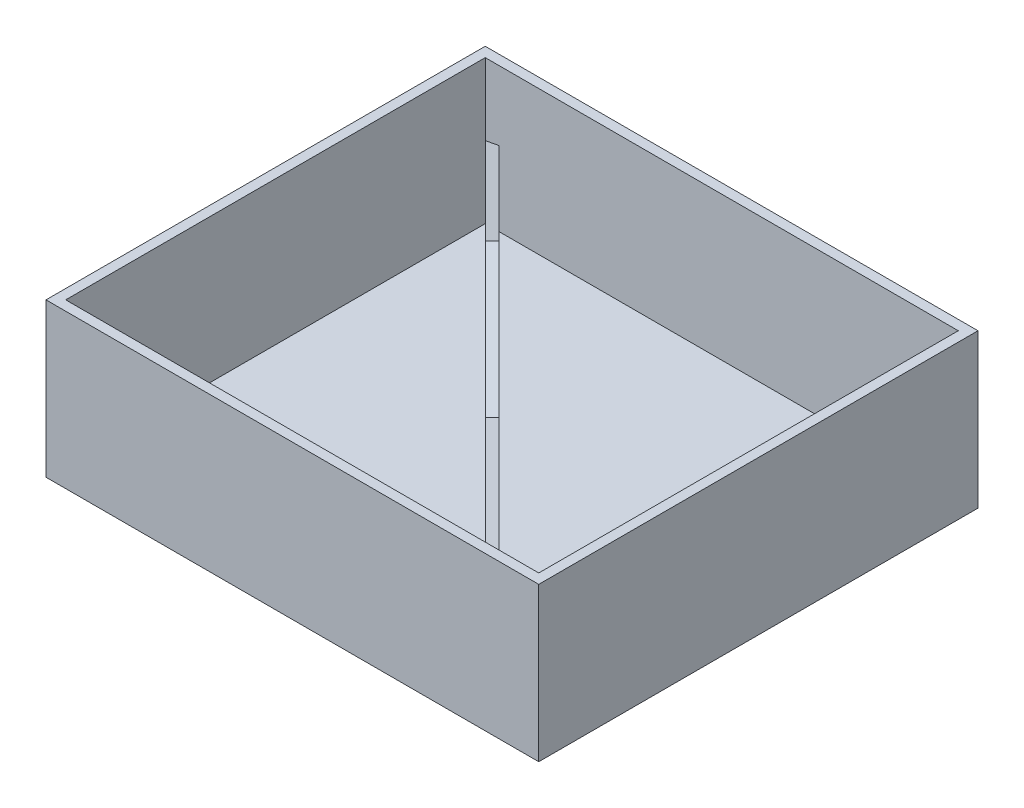
ISO-10303-21;
HEADER;
FILE_DESCRIPTION(('STEP AP214'),'2;1');
FILE_NAME('part.step','',(''),(''),'','','');
FILE_SCHEMA(('AUTOMOTIVE_DESIGN { 1 0 10303 214 1 1 1 1 }'));
ENDSEC;
DATA;
#1=APPLICATION_CONTEXT('core data for automotive mechanical design processes');
#2=APPLICATION_PROTOCOL_DEFINITION('international standard','automotive_design',2000,#1);
#3=PRODUCT_CONTEXT('',#1,'mechanical');
#4=PRODUCT('Part','Part','',(#3));
#5=PRODUCT_RELATED_PRODUCT_CATEGORY('part','',(#4));
#6=PRODUCT_DEFINITION_FORMATION('','',#4);
#7=PRODUCT_DEFINITION_CONTEXT('part definition',#1,'design');
#8=PRODUCT_DEFINITION('design','',#6,#7);
#9=PRODUCT_DEFINITION_SHAPE('','',#8);
#10=(LENGTH_UNIT() NAMED_UNIT(*) SI_UNIT(.MILLI.,.METRE.));
#11=(NAMED_UNIT(*) PLANE_ANGLE_UNIT() SI_UNIT($,.RADIAN.));
#12=(NAMED_UNIT(*) SI_UNIT($,.STERADIAN.) SOLID_ANGLE_UNIT());
#13=UNCERTAINTY_MEASURE_WITH_UNIT(LENGTH_MEASURE(1.E-05),#10,'distance_accuracy_value','');
#14=(GEOMETRIC_REPRESENTATION_CONTEXT(3) GLOBAL_UNCERTAINTY_ASSIGNED_CONTEXT((#13)) GLOBAL_UNIT_ASSIGNED_CONTEXT((#10,
#11,#12)) REPRESENTATION_CONTEXT('',''));
#15=CARTESIAN_POINT('',(0.,0.,0.));
#16=DIRECTION('',(0.,0.,1.));
#17=DIRECTION('',(1.,0.,0.));
#18=AXIS2_PLACEMENT_3D('',#15,#16,#17);
#19=CARTESIAN_POINT('',(0.,2.54,0.));
#20=DIRECTION('',(0.,1.,0.));
#21=DIRECTION('',(0.,0.,1.));
#22=AXIS2_PLACEMENT_3D('',#19,#20,#21);
#23=PLANE('',#22);
#24=DIRECTION('',(-1.,0.,0.));
#25=VECTOR('',#24,1.);
#26=CARTESIAN_POINT('',(-62.4778997860176,2.54,-61.397043942379));
#27=LINE('',#26,#25);
#28=CARTESIAN_POINT('',(62.0602912861796,2.54,-61.397043942379));
#29=VERTEX_POINT('',#28);
#30=CARTESIAN_POINT('',(-56.34579733759,2.54,-61.397043942379));
#31=VERTEX_POINT('',#30);
#32=EDGE_CURVE('E204',#29,#31,#27,.T.);
#33=ORIENTED_EDGE('',*,*,#32,.T.);
#34=DIRECTION('',(0.707106781186548,0.,0.707106781186547));
#35=VECTOR('',#34,1.);
#36=CARTESIAN_POINT('',(2.5256233023945,2.54,-2.5256233023945));
#37=LINE('',#36,#35);
#38=CARTESIAN_POINT('',(51.8568489835545,2.54,46.8056023787655));
#39=VERTEX_POINT('',#38);
#40=EDGE_CURVE('E245',#31,#39,#37,.T.);
#41=ORIENTED_EDGE('',*,*,#40,.T.);
#42=DIRECTION('',(1.,0.,0.));
#43=VECTOR('',#42,1.);
#44=CARTESIAN_POINT('',(-62.4778997860176,2.54,46.8056023787655));
#45=LINE('',#44,#43);
#46=CARTESIAN_POINT('',(62.0602912861796,2.54,46.8056023787655));
#47=VERTEX_POINT('',#46);
#48=EDGE_CURVE('E184',#39,#47,#45,.T.);
#49=ORIENTED_EDGE('',*,*,#48,.T.);
#50=DIRECTION('',(0.,0.,-1.));
#51=VECTOR('',#50,1.);
#52=CARTESIAN_POINT('',(62.0602912861796,2.54,-63.9370439423789));
#53=LINE('',#52,#51);
#54=EDGE_CURVE('E199',#47,#29,#53,.T.);
#55=ORIENTED_EDGE('',*,*,#54,.T.);
#56=EDGE_LOOP('',(#33,#41,#49,#55));
#57=FACE_BOUND('',#56,.T.);
#58=ADVANCED_FACE('F43',(#57),#23,.T.);
#59=CARTESIAN_POINT('',(-62.4778997860176,39.624,-63.9370439423789));
#60=DIRECTION('',(1.,0.,0.));
#61=DIRECTION('',(0.,0.,-1.));
#62=AXIS2_PLACEMENT_3D('',#59,#60,#61);
#63=PLANE('',#62);
#64=DIRECTION('',(0.,0.,1.));
#65=VECTOR('',#64,1.);
#66=CARTESIAN_POINT('',(-62.4778997860176,0.,-63.9370439423789));
#67=LINE('',#66,#65);
#68=CARTESIAN_POINT('',(-62.4778997860176,0.,-63.9370439423789));
#69=VERTEX_POINT('',#68);
#70=CARTESIAN_POINT('',(-62.4778997860176,0.,49.3456023787655));
#71=VERTEX_POINT('',#70);
#72=EDGE_CURVE('E186',#69,#71,#67,.T.);
#73=ORIENTED_EDGE('',*,*,#72,.T.);
#74=DIRECTION('',(0.,-1.,0.));
#75=VECTOR('',#74,1.);
#76=CARTESIAN_POINT('',(-62.4778997860176,39.624,49.3456023787655));
#77=LINE('',#76,#75);
#78=CARTESIAN_POINT('',(-62.4778997860176,39.624,49.3456023787655));
#79=VERTEX_POINT('',#78);
#80=EDGE_CURVE('E237',#79,#71,#77,.T.);
#81=ORIENTED_EDGE('',*,*,#80,.F.);
#82=DIRECTION('',(0.,0.,1.));
#83=VECTOR('',#82,1.);
#84=CARTESIAN_POINT('',(-62.4778997860176,39.624,-63.9370439423789));
#85=LINE('',#84,#83);
#86=CARTESIAN_POINT('',(-62.4778997860176,39.624,-63.9370439423789));
#87=VERTEX_POINT('',#86);
#88=EDGE_CURVE('E214',#87,#79,#85,.T.);
#89=ORIENTED_EDGE('',*,*,#88,.F.);
#90=DIRECTION('',(0.,-1.,0.));
#91=VECTOR('',#90,1.);
#92=CARTESIAN_POINT('',(-62.4778997860176,39.624,-63.9370439423789));
#93=LINE('',#92,#91);
#94=EDGE_CURVE('E225',#87,#69,#93,.T.);
#95=ORIENTED_EDGE('',*,*,#94,.T.);
#96=EDGE_LOOP('',(#73,#81,#89,#95));
#97=FACE_BOUND('',#96,.T.);
#98=ADVANCED_FACE('F44',(#97),#63,.F.);
#99=CARTESIAN_POINT('',(-62.4778997860176,39.624,49.3456023787655));
#100=DIRECTION('',(0.,0.,-1.));
#101=DIRECTION('',(-1.,0.,0.));
#102=AXIS2_PLACEMENT_3D('',#99,#100,#101);
#103=PLANE('',#102);
#104=DIRECTION('',(1.,0.,0.));
#105=VECTOR('',#104,1.);
#106=CARTESIAN_POINT('',(-62.4778997860176,0.,49.3456023787655));
#107=LINE('',#106,#105);
#108=CARTESIAN_POINT('',(64.6002912861796,0.,49.3456023787655));
#109=VERTEX_POINT('',#108);
#110=EDGE_CURVE('E228',#71,#109,#107,.T.);
#111=ORIENTED_EDGE('',*,*,#110,.T.);
#112=DIRECTION('',(0.,-1.,0.));
#113=VECTOR('',#112,1.);
#114=CARTESIAN_POINT('',(64.6002912861796,39.624,49.3456023787655));
#115=LINE('',#114,#113);
#116=CARTESIAN_POINT('',(64.6002912861796,39.624,49.3456023787655));
#117=VERTEX_POINT('',#116);
#118=EDGE_CURVE('E236',#117,#109,#115,.T.);
#119=ORIENTED_EDGE('',*,*,#118,.F.);
#120=DIRECTION('',(1.,0.,0.));
#121=VECTOR('',#120,1.);
#122=CARTESIAN_POINT('',(-62.4778997860176,39.624,49.3456023787655));
#123=LINE('',#122,#121);
#124=EDGE_CURVE('E216',#79,#117,#123,.T.);
#125=ORIENTED_EDGE('',*,*,#124,.F.);
#126=ORIENTED_EDGE('',*,*,#80,.T.);
#127=EDGE_LOOP('',(#111,#119,#125,#126));
#128=FACE_BOUND('',#127,.T.);
#129=ADVANCED_FACE('F285',(#128),#103,.F.);
#130=CARTESIAN_POINT('',(64.6002912861796,39.624,-63.9370439423789));
#131=DIRECTION('',(-1.,0.,0.));
#132=DIRECTION('',(0.,0.,1.));
#133=AXIS2_PLACEMENT_3D('',#130,#131,#132);
#134=PLANE('',#133);
#135=DIRECTION('',(0.,0.,-1.));
#136=VECTOR('',#135,1.);
#137=CARTESIAN_POINT('',(64.6002912861796,0.,-63.9370439423789));
#138=LINE('',#137,#136);
#139=CARTESIAN_POINT('',(64.6002912861796,0.,-63.9370439423789));
#140=VERTEX_POINT('',#139);
#141=EDGE_CURVE('E226',#109,#140,#138,.T.);
#142=ORIENTED_EDGE('',*,*,#141,.T.);
#143=DIRECTION('',(0.,-1.,0.));
#144=VECTOR('',#143,1.);
#145=CARTESIAN_POINT('',(64.6002912861796,39.624,-63.9370439423789));
#146=LINE('',#145,#144);
#147=CARTESIAN_POINT('',(64.6002912861796,39.624,-63.9370439423789));
#148=VERTEX_POINT('',#147);
#149=EDGE_CURVE('E231',#148,#140,#146,.T.);
#150=ORIENTED_EDGE('',*,*,#149,.F.);
#151=DIRECTION('',(0.,0.,-1.));
#152=VECTOR('',#151,1.);
#153=CARTESIAN_POINT('',(64.6002912861796,39.624,-63.9370439423789));
#154=LINE('',#153,#152);
#155=EDGE_CURVE('E218',#117,#148,#154,.T.);
#156=ORIENTED_EDGE('',*,*,#155,.F.);
#157=ORIENTED_EDGE('',*,*,#118,.T.);
#158=EDGE_LOOP('',(#142,#150,#156,#157));
#159=FACE_BOUND('',#158,.T.);
#160=ADVANCED_FACE('F385',(#159),#134,.F.);
#161=CARTESIAN_POINT('',(-62.4778997860176,39.624,-63.9370439423789));
#162=DIRECTION('',(0.,0.,1.));
#163=DIRECTION('',(1.,0.,0.));
#164=AXIS2_PLACEMENT_3D('',#161,#162,#163);
#165=PLANE('',#164);
#166=DIRECTION('',(-1.,0.,0.));
#167=VECTOR('',#166,1.);
#168=CARTESIAN_POINT('',(-62.4778997860176,0.,-63.9370439423789));
#169=LINE('',#168,#167);
#170=EDGE_CURVE('E217',#140,#69,#169,.T.);
#171=ORIENTED_EDGE('',*,*,#170,.T.);
#172=ORIENTED_EDGE('',*,*,#94,.F.);
#173=DIRECTION('',(-1.,0.,0.));
#174=VECTOR('',#173,1.);
#175=CARTESIAN_POINT('',(-62.4778997860176,39.624,-63.9370439423789));
#176=LINE('',#175,#174);
#177=EDGE_CURVE('E222',#148,#87,#176,.T.);
#178=ORIENTED_EDGE('',*,*,#177,.F.);
#179=ORIENTED_EDGE('',*,*,#149,.T.);
#180=EDGE_LOOP('',(#171,#172,#178,#179));
#181=FACE_BOUND('',#180,.T.);
#182=ADVANCED_FACE('F374',(#181),#165,.F.);
#183=CARTESIAN_POINT('',(0.,39.624,0.));
#184=DIRECTION('',(0.,1.,0.));
#185=DIRECTION('',(0.,0.,1.));
#186=AXIS2_PLACEMENT_3D('',#183,#184,#185);
#187=PLANE('',#186);
#188=DIRECTION('',(0.,0.,1.));
#189=VECTOR('',#188,1.);
#190=CARTESIAN_POINT('',(-59.9378997860176,39.624,-63.9370439423789));
#191=LINE('',#190,#189);
#192=CARTESIAN_POINT('',(-59.9378997860176,39.624,-61.397043942379));
#193=VERTEX_POINT('',#192);
#194=CARTESIAN_POINT('',(-59.9378997860176,39.624,46.8056023787655));
#195=VERTEX_POINT('',#194);
#196=EDGE_CURVE('E207',#193,#195,#191,.T.);
#197=ORIENTED_EDGE('',*,*,#196,.F.);
#198=DIRECTION('',(-1.,0.,0.));
#199=VECTOR('',#198,1.);
#200=CARTESIAN_POINT('',(-62.4778997860176,39.624,-61.397043942379));
#201=LINE('',#200,#199);
#202=CARTESIAN_POINT('',(62.0602912861796,39.624,-61.397043942379));
#203=VERTEX_POINT('',#202);
#204=EDGE_CURVE('E191',#203,#193,#201,.T.);
#205=ORIENTED_EDGE('',*,*,#204,.F.);
#206=DIRECTION('',(0.,0.,-1.));
#207=VECTOR('',#206,1.);
#208=CARTESIAN_POINT('',(62.0602912861796,39.624,-63.9370439423789));
#209=LINE('',#208,#207);
#210=CARTESIAN_POINT('',(62.0602912861796,39.624,46.8056023787655));
#211=VERTEX_POINT('',#210);
#212=EDGE_CURVE('E208',#211,#203,#209,.T.);
#213=ORIENTED_EDGE('',*,*,#212,.F.);
#214=DIRECTION('',(1.,0.,0.));
#215=VECTOR('',#214,1.);
#216=CARTESIAN_POINT('',(-62.4778997860176,39.624,46.8056023787655));
#217=LINE('',#216,#215);
#218=EDGE_CURVE('E206',#195,#211,#217,.T.);
#219=ORIENTED_EDGE('',*,*,#218,.F.);
#220=EDGE_LOOP('',(#197,#205,#213,#219));
#221=FACE_BOUND('',#220,.T.);
#222=ORIENTED_EDGE('',*,*,#88,.T.);
#223=ORIENTED_EDGE('',*,*,#124,.T.);
#224=ORIENTED_EDGE('',*,*,#155,.T.);
#225=ORIENTED_EDGE('',*,*,#177,.T.);
#226=EDGE_LOOP('',(#222,#223,#224,#225));
#227=FACE_BOUND('',#226,.T.);
#228=ADVANCED_FACE('F258',(#221,#227),#187,.T.);
#229=CARTESIAN_POINT('',(0.,0.,0.));
#230=DIRECTION('',(0.,1.,0.));
#231=DIRECTION('',(0.,0.,1.));
#232=AXIS2_PLACEMENT_3D('',#229,#230,#231);
#233=PLANE('',#232);
#234=ORIENTED_EDGE('',*,*,#72,.F.);
#235=ORIENTED_EDGE('',*,*,#170,.F.);
#236=ORIENTED_EDGE('',*,*,#141,.F.);
#237=ORIENTED_EDGE('',*,*,#110,.F.);
#238=EDGE_LOOP('',(#234,#235,#236,#237));
#239=FACE_BOUND('',#238,.T.);
#240=ADVANCED_FACE('F299',(#239),#233,.F.);
#241=CARTESIAN_POINT('',(-59.9378997860176,39.624,-63.9370439423789));
#242=DIRECTION('',(1.,0.,0.));
#243=DIRECTION('',(0.,0.,-1.));
#244=AXIS2_PLACEMENT_3D('',#241,#242,#243);
#245=PLANE('',#244);
#246=DIRECTION('',(0.,0.,1.));
#247=VECTOR('',#246,1.);
#248=CARTESIAN_POINT('',(-59.9378997860176,2.54,-63.9370439423789));
#249=LINE('',#248,#247);
#250=CARTESIAN_POINT('',(-59.9378997860176,2.54,-61.3970439423789));
#251=VERTEX_POINT('',#250);
#252=CARTESIAN_POINT('',(-59.9378997860176,2.54,46.8056023787655));
#253=VERTEX_POINT('',#252);
#254=EDGE_CURVE('E185',#251,#253,#249,.T.);
#255=ORIENTED_EDGE('',*,*,#254,.F.);
#256=DIRECTION('',(0.,-1.,0.));
#257=VECTOR('',#256,1.);
#258=CARTESIAN_POINT('',(-59.9378997860176,39.624,-61.397043942379));
#259=LINE('',#258,#257);
#260=CARTESIAN_POINT('',(-59.9378997860176,21.0820649897881,-61.397043942379));
#261=VERTEX_POINT('',#260);
#262=EDGE_CURVE('E177',#261,#251,#259,.T.);
#263=ORIENTED_EDGE('',*,*,#262,.F.);
#264=DIRECTION('',(0.,-1.,0.));
#265=VECTOR('',#264,1.);
#266=CARTESIAN_POINT('',(-59.9378997860176,39.624,-61.397043942379));
#267=LINE('',#266,#265);
#268=EDGE_CURVE('E192',#193,#261,#267,.T.);
#269=ORIENTED_EDGE('',*,*,#268,.F.);
#270=ORIENTED_EDGE('',*,*,#196,.T.);
#271=DIRECTION('',(0.,-1.,0.));
#272=VECTOR('',#271,1.);
#273=CARTESIAN_POINT('',(-59.9378997860176,39.624,46.8056023787655));
#274=LINE('',#273,#272);
#275=EDGE_CURVE('E187',#195,#253,#274,.T.);
#276=ORIENTED_EDGE('',*,*,#275,.T.);
#277=EDGE_LOOP('',(#255,#263,#269,#270,#276));
#278=FACE_BOUND('',#277,.T.);
#279=ADVANCED_FACE('F251',(#278),#245,.T.);
#280=CARTESIAN_POINT('',(-62.4778997860176,39.624,46.8056023787655));
#281=DIRECTION('',(0.,0.,-1.));
#282=DIRECTION('',(-1.,0.,0.));
#283=AXIS2_PLACEMENT_3D('',#280,#281,#282);
#284=PLANE('',#283);
#285=DIRECTION('',(0.,1.,0.));
#286=VECTOR('',#285,1.);
#287=CARTESIAN_POINT('',(48.2647465351269,39.624,46.8056023787655));
#288=LINE('',#287,#286);
#289=CARTESIAN_POINT('',(48.2647465351269,2.54,46.8056023787655));
#290=VERTEX_POINT('',#289);
#291=CARTESIAN_POINT('',(48.2647465351269,33.5358900537595,46.8056023787655));
#292=VERTEX_POINT('',#291);
#293=EDGE_CURVE('E163',#290,#292,#288,.T.);
#294=ORIENTED_EDGE('',*,*,#293,.F.);
#295=EDGE_CURVE('E193',#253,#290,#45,.T.);
#296=ORIENTED_EDGE('',*,*,#295,.F.);
#297=ORIENTED_EDGE('',*,*,#275,.F.);
#298=ORIENTED_EDGE('',*,*,#218,.T.);
#299=DIRECTION('',(0.,-1.,0.));
#300=VECTOR('',#299,1.);
#301=CARTESIAN_POINT('',(62.0602912861796,39.624,46.8056023787655));
#302=LINE('',#301,#300);
#303=EDGE_CURVE('E188',#211,#47,#302,.T.);
#304=ORIENTED_EDGE('',*,*,#303,.T.);
#305=ORIENTED_EDGE('',*,*,#48,.F.);
#306=DIRECTION('',(0.,1.,0.));
#307=VECTOR('',#306,1.);
#308=CARTESIAN_POINT('',(51.8568489835545,39.624,46.8056023787655));
#309=LINE('',#308,#307);
#310=CARTESIAN_POINT('',(51.8568489835545,33.8850458328477,46.8056023787655));
#311=VERTEX_POINT('',#310);
#312=EDGE_CURVE('E59',#39,#311,#309,.T.);
#313=ORIENTED_EDGE('',*,*,#312,.T.);
#314=DIRECTION('',(-0.995309200473239,-0.0967450022136603,0.));
#315=VECTOR('',#314,1.);
#316=CARTESIAN_POINT('',(-60.855162060558,22.9293310129866,46.8056023787655));
#317=LINE('',#316,#315);
#318=EDGE_CURVE('E11',#292,#311,#317,.F.);
#319=ORIENTED_EDGE('',*,*,#318,.F.);
#320=EDGE_LOOP('',(#294,#296,#297,#298,#304,#305,#313,#319));
#321=FACE_BOUND('',#320,.T.);
#322=ADVANCED_FACE('F265',(#321),#284,.T.);
#323=CARTESIAN_POINT('',(62.0602912861796,39.624,-63.9370439423789));
#324=DIRECTION('',(-1.,0.,0.));
#325=DIRECTION('',(0.,0.,1.));
#326=AXIS2_PLACEMENT_3D('',#323,#324,#325);
#327=PLANE('',#326);
#328=ORIENTED_EDGE('',*,*,#54,.F.);
#329=ORIENTED_EDGE('',*,*,#303,.F.);
#330=ORIENTED_EDGE('',*,*,#212,.T.);
#331=DIRECTION('',(0.,-1.,0.));
#332=VECTOR('',#331,1.);
#333=CARTESIAN_POINT('',(62.0602912861796,39.624,-61.397043942379));
#334=LINE('',#333,#332);
#335=EDGE_CURVE('E66',#203,#29,#334,.T.);
#336=ORIENTED_EDGE('',*,*,#335,.T.);
#337=EDGE_LOOP('',(#328,#329,#330,#336));
#338=FACE_BOUND('',#337,.T.);
#339=ADVANCED_FACE('F277',(#338),#327,.T.);
#340=CARTESIAN_POINT('',(-62.4778997860176,39.624,-61.397043942379));
#341=DIRECTION('',(0.,0.,1.));
#342=DIRECTION('',(1.,0.,0.));
#343=AXIS2_PLACEMENT_3D('',#340,#341,#342);
#344=PLANE('',#343);
#345=DIRECTION('',(0.981937401623452,0.189206076258095,0.));
#346=VECTOR('',#345,1.);
#347=CARTESIAN_POINT('',(-58.9420917631022,21.2739437474469,-61.397043942379));
#348=LINE('',#347,#346);
#349=CARTESIAN_POINT('',(-56.34579733759,21.7742146203658,-61.397043942379));
#350=VERTEX_POINT('',#349);
#351=EDGE_CURVE('E51',#350,#261,#348,.F.);
#352=ORIENTED_EDGE('',*,*,#351,.F.);
#353=DIRECTION('',(0.,-1.,0.));
#354=VECTOR('',#353,1.);
#355=CARTESIAN_POINT('',(-56.34579733759,39.624,-61.397043942379));
#356=LINE('',#355,#354);
#357=EDGE_CURVE('E152',#350,#31,#356,.T.);
#358=ORIENTED_EDGE('',*,*,#357,.T.);
#359=ORIENTED_EDGE('',*,*,#32,.F.);
#360=ORIENTED_EDGE('',*,*,#335,.F.);
#361=ORIENTED_EDGE('',*,*,#204,.T.);
#362=ORIENTED_EDGE('',*,*,#268,.T.);
#363=EDGE_LOOP('',(#352,#358,#359,#360,#361,#362));
#364=FACE_BOUND('',#363,.T.);
#365=ADVANCED_FACE('F257',(#364),#344,.T.);
#366=DIRECTION('',(0.707106781186548,0.,0.707106781186547));
#367=VECTOR('',#366,1.);
#368=CARTESIAN_POINT('',(0.729572078180674,2.54,-0.729572078180674));
#369=LINE('',#368,#367);
#370=EDGE_CURVE('E242',#251,#290,#369,.T.);
#371=ORIENTED_EDGE('',*,*,#370,.F.);
#372=ORIENTED_EDGE('',*,*,#254,.T.);
#373=ORIENTED_EDGE('',*,*,#295,.T.);
#374=EDGE_LOOP('',(#371,#372,#373));
#375=FACE_BOUND('',#374,.T.);
#376=ADVANCED_FACE('F270',(#375),#23,.T.);
#377=CARTESIAN_POINT('',(6.19267906962794,25.357,4.73353491326659));
#378=DIRECTION('',(0.0962954087319371,-0.990683798451503,0.0962954087319371));
#379=DIRECTION('',(0.700519231896705,0.136182273022966,0.700519231896705));
#380=AXIS2_PLACEMENT_3D('',#377,#378,#379);
#381=PLANE('',#380);
#382=DIRECTION('',(0.700519231896705,0.136182273022966,0.700519231896705));
#383=VECTOR('',#382,1.);
#384=CARTESIAN_POINT('',(6.19267906962794,25.357,4.73353491326659));
#385=LINE('',#384,#383);
#386=CARTESIAN_POINT('',(6.19267906962794,25.357,4.73353491326659));
#387=VERTEX_POINT('',#386);
#388=EDGE_CURVE('E143',#387,#292,#385,.T.);
#389=ORIENTED_EDGE('',*,*,#388,.T.);
#390=ORIENTED_EDGE('',*,*,#318,.T.);
#391=DIRECTION('',(0.700519231896705,0.136182273022966,0.700519231896705));
#392=VECTOR('',#391,1.);
#393=CARTESIAN_POINT('',(7.98873029384178,25.357,2.93748368905276));
#394=LINE('',#393,#392);
#395=CARTESIAN_POINT('',(7.98873029384177,25.357,2.93748368905276));
#396=VERTEX_POINT('',#395);
#397=EDGE_CURVE('E150',#396,#311,#394,.T.);
#398=ORIENTED_EDGE('',*,*,#397,.F.);
#399=DIRECTION('',(-0.707106781186547,0.,0.707106781186548));
#400=VECTOR('',#399,1.);
#401=CARTESIAN_POINT('',(6.19267906962794,25.357,4.73353491326659));
#402=LINE('',#401,#400);
#403=EDGE_CURVE('E145',#396,#387,#402,.T.);
#404=ORIENTED_EDGE('',*,*,#403,.T.);
#405=EDGE_LOOP('',(#389,#390,#398,#404));
#406=FACE_BOUND('',#405,.T.);
#407=ADVANCED_FACE('F144',(#406),#381,.F.);
#408=CARTESIAN_POINT('',(-23.4746930418348,35.134,-24.9338371981962));
#409=DIRECTION('',(-0.160477384938449,-0.973906575522844,-0.160477384938449));
#410=DIRECTION('',(0.688655943794372,-0.226949294234123,0.688655943794372));
#411=AXIS2_PLACEMENT_3D('',#408,#409,#410);
#412=PLANE('',#411);
#413=ORIENTED_EDGE('',*,*,#403,.F.);
#414=DIRECTION('',(0.688655943794372,-0.226949294234123,0.688655943794372));
#415=VECTOR('',#414,1.);
#416=CARTESIAN_POINT('',(-21.678641817621,35.134,-26.72988842241));
#417=LINE('',#416,#415);
#418=CARTESIAN_POINT('',(-21.678641817621,35.134,-26.72988842241));
#419=VERTEX_POINT('',#418);
#420=EDGE_CURVE('E175',#419,#396,#417,.T.);
#421=ORIENTED_EDGE('',*,*,#420,.F.);
#422=DIRECTION('',(-0.707106781186547,0.,0.707106781186548));
#423=VECTOR('',#422,1.);
#424=CARTESIAN_POINT('',(-23.4746930418348,35.134,-24.9338371981962));
#425=LINE('',#424,#423);
#426=CARTESIAN_POINT('',(-23.4746930418348,35.134,-24.9338371981962));
#427=VERTEX_POINT('',#426);
#428=EDGE_CURVE('E154',#419,#427,#425,.T.);
#429=ORIENTED_EDGE('',*,*,#428,.T.);
#430=DIRECTION('',(0.688655943794372,-0.226949294234123,0.688655943794372));
#431=VECTOR('',#430,1.);
#432=CARTESIAN_POINT('',(-23.4746930418348,35.134,-24.9338371981962));
#433=LINE('',#432,#431);
#434=EDGE_CURVE('E156',#427,#387,#433,.T.);
#435=ORIENTED_EDGE('',*,*,#434,.T.);
#436=EDGE_LOOP('',(#413,#421,#429,#435));
#437=FACE_BOUND('',#436,.T.);
#438=ADVANCED_FACE('F164',(#437),#412,.F.);
#439=CARTESIAN_POINT('',(-59.9380684272816,21.082,-61.3972125836429));
#440=DIRECTION('',(0.185907687388523,-0.96481949790606,0.185907687388523));
#441=DIRECTION('',(0.682230409590376,0.262913172854267,0.682230409590375));
#442=AXIS2_PLACEMENT_3D('',#439,#440,#441);
#443=PLANE('',#442);
#444=DIRECTION('',(0.682230409590376,0.262913172854267,0.682230409590375));
#445=VECTOR('',#444,1.);
#446=CARTESIAN_POINT('',(-58.1420172030677,21.082,-63.1932638078567));
#447=LINE('',#446,#445);
#448=EDGE_CURVE('E162',#350,#419,#447,.T.);
#449=ORIENTED_EDGE('',*,*,#448,.F.);
#450=ORIENTED_EDGE('',*,*,#351,.T.);
#451=DIRECTION('',(0.682230409590376,0.262913172854267,0.682230409590375));
#452=VECTOR('',#451,1.);
#453=CARTESIAN_POINT('',(-59.9380684272816,21.082,-61.3972125836429));
#454=LINE('',#453,#452);
#455=EDGE_CURVE('E170',#261,#427,#454,.T.);
#456=ORIENTED_EDGE('',*,*,#455,.T.);
#457=ORIENTED_EDGE('',*,*,#428,.F.);
#458=EDGE_LOOP('',(#449,#450,#456,#457));
#459=FACE_BOUND('',#458,.T.);
#460=ADVANCED_FACE('F247',(#459),#443,.F.);
#461=CARTESIAN_POINT('',(7.14786248548236,28.0443994247742,5.68871832912101));
#462=DIRECTION('',(-0.707106781186547,0.,0.707106781186548));
#463=DIRECTION('',(0.707106781186548,0.,0.707106781186547));
#464=AXIS2_PLACEMENT_3D('',#461,#462,#463);
#465=PLANE('',#464);
#466=ORIENTED_EDGE('',*,*,#370,.T.);
#467=ORIENTED_EDGE('',*,*,#293,.T.);
#468=ORIENTED_EDGE('',*,*,#388,.F.);
#469=ORIENTED_EDGE('',*,*,#434,.F.);
#470=ORIENTED_EDGE('',*,*,#455,.F.);
#471=ORIENTED_EDGE('',*,*,#262,.T.);
#472=EDGE_LOOP('',(#466,#467,#468,#469,#470,#471));
#473=FACE_BOUND('',#472,.T.);
#474=ADVANCED_FACE('F159',(#473),#465,.T.);
#475=CARTESIAN_POINT('',(8.94391370969619,28.0443994247742,3.89266710490718));
#476=DIRECTION('',(-0.707106781186547,0.,0.707106781186548));
#477=DIRECTION('',(0.707106781186548,0.,0.707106781186547));
#478=AXIS2_PLACEMENT_3D('',#475,#476,#477);
#479=PLANE('',#478);
#480=ORIENTED_EDGE('',*,*,#312,.F.);
#481=ORIENTED_EDGE('',*,*,#40,.F.);
#482=ORIENTED_EDGE('',*,*,#357,.F.);
#483=ORIENTED_EDGE('',*,*,#448,.T.);
#484=ORIENTED_EDGE('',*,*,#420,.T.);
#485=ORIENTED_EDGE('',*,*,#397,.T.);
#486=EDGE_LOOP('',(#480,#481,#482,#483,#484,#485));
#487=FACE_BOUND('',#486,.T.);
#488=ADVANCED_FACE('F286',(#487),#479,.F.);
#489=CLOSED_SHELL('',(#58,#98,#129,#160,#182,#228,#240,#279,#322,#339,#365,#376,#407,#438,#460,
#474,#488));
#490=MANIFOLD_SOLID_BREP('B2',#489);
#491=ADVANCED_BREP_SHAPE_REPRESENTATION('',(#18,#490),#14);
#492=SHAPE_DEFINITION_REPRESENTATION(#9,#491);
ENDSEC;
END-ISO-10303-21;
